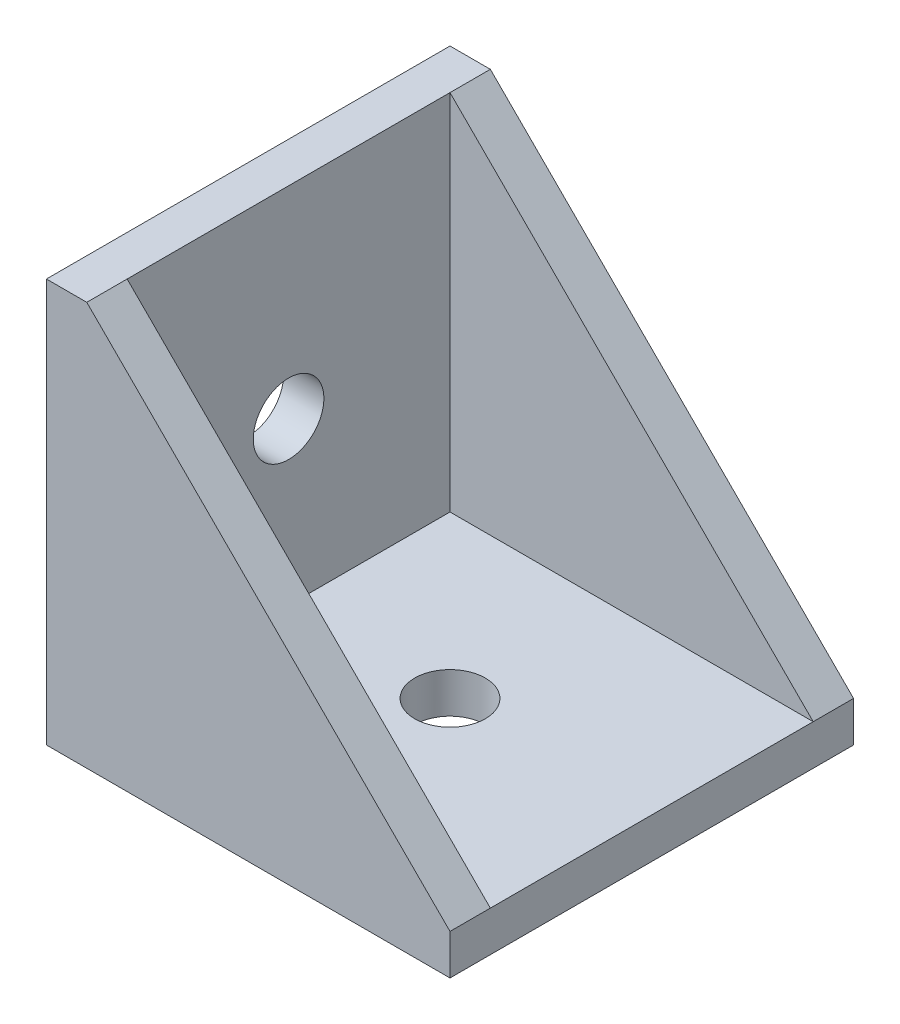
ISO-10303-21;
HEADER;
FILE_DESCRIPTION(('STEP AP214'),'2;1');
FILE_NAME('part.step','',(''),(''),'','','');
FILE_SCHEMA(('AUTOMOTIVE_DESIGN { 1 0 10303 214 1 1 1 1 }'));
ENDSEC;
DATA;
#1=APPLICATION_CONTEXT('core data for automotive mechanical design processes');
#2=APPLICATION_PROTOCOL_DEFINITION('international standard','automotive_design',2000,#1);
#3=PRODUCT_CONTEXT('',#1,'mechanical');
#4=PRODUCT('Part','Part','',(#3));
#5=PRODUCT_RELATED_PRODUCT_CATEGORY('part','',(#4));
#6=PRODUCT_DEFINITION_FORMATION('','',#4);
#7=PRODUCT_DEFINITION_CONTEXT('part definition',#1,'design');
#8=PRODUCT_DEFINITION('design','',#6,#7);
#9=PRODUCT_DEFINITION_SHAPE('','',#8);
#10=(LENGTH_UNIT() NAMED_UNIT(*) SI_UNIT(.MILLI.,.METRE.));
#11=(NAMED_UNIT(*) PLANE_ANGLE_UNIT() SI_UNIT($,.RADIAN.));
#12=(NAMED_UNIT(*) SI_UNIT($,.STERADIAN.) SOLID_ANGLE_UNIT());
#13=UNCERTAINTY_MEASURE_WITH_UNIT(LENGTH_MEASURE(1.E-05),#10,'distance_accuracy_value','');
#14=(GEOMETRIC_REPRESENTATION_CONTEXT(3) GLOBAL_UNCERTAINTY_ASSIGNED_CONTEXT((#13)) GLOBAL_UNIT_ASSIGNED_CONTEXT((#10,
#11,#12)) REPRESENTATION_CONTEXT('',''));
#15=CARTESIAN_POINT('',(0.,0.,0.));
#16=DIRECTION('',(0.,0.,1.));
#17=DIRECTION('',(1.,0.,0.));
#18=AXIS2_PLACEMENT_3D('',#15,#16,#17);
#19=CARTESIAN_POINT('',(2.,20.,20.));
#20=DIRECTION('',(-0.707106781186548,-0.707106781186548,0.));
#21=DIRECTION('',(0.707106781186548,-0.707106781186548,0.));
#22=AXIS2_PLACEMENT_3D('',#19,#20,#21);
#23=PLANE('',#22);
#24=DIRECTION('',(0.,0.,-1.));
#25=VECTOR('',#24,1.);
#26=CARTESIAN_POINT('',(2.,20.,20.));
#27=LINE('',#26,#25);
#28=CARTESIAN_POINT('',(2.,20.,2.));
#29=VERTEX_POINT('',#28);
#30=CARTESIAN_POINT('',(2.,20.,0.));
#31=VERTEX_POINT('',#30);
#32=EDGE_CURVE('E163',#29,#31,#27,.T.);
#33=ORIENTED_EDGE('',*,*,#32,.F.);
#34=DIRECTION('',(0.707106781186548,-0.707106781186548,0.));
#35=VECTOR('',#34,1.);
#36=CARTESIAN_POINT('',(2.,20.,2.));
#37=LINE('',#36,#35);
#38=CARTESIAN_POINT('',(20.,2.,2.));
#39=VERTEX_POINT('',#38);
#40=EDGE_CURVE('E11',#29,#39,#37,.T.);
#41=ORIENTED_EDGE('',*,*,#40,.T.);
#42=DIRECTION('',(0.,0.,-1.));
#43=VECTOR('',#42,1.);
#44=CARTESIAN_POINT('',(20.,2.,20.));
#45=LINE('',#44,#43);
#46=CARTESIAN_POINT('',(20.,2.,0.));
#47=VERTEX_POINT('',#46);
#48=EDGE_CURVE('E132',#39,#47,#45,.T.);
#49=ORIENTED_EDGE('',*,*,#48,.T.);
#50=DIRECTION('',(-0.707106781186547,0.707106781186547,0.));
#51=VECTOR('',#50,1.);
#52=CARTESIAN_POINT('',(2.,20.,0.));
#53=LINE('',#52,#51);
#54=EDGE_CURVE('E154',#47,#31,#53,.T.);
#55=ORIENTED_EDGE('',*,*,#54,.T.);
#56=EDGE_LOOP('',(#33,#41,#49,#55));
#57=FACE_BOUND('',#56,.T.);
#58=ADVANCED_FACE('F43',(#57),#23,.F.);
#59=CARTESIAN_POINT('',(0.,0.,20.));
#60=DIRECTION('',(1.,0.,0.));
#61=DIRECTION('',(0.,0.,-1.));
#62=AXIS2_PLACEMENT_3D('',#59,#60,#61);
#63=PLANE('',#62);
#64=CARTESIAN_POINT('',(0.,9.99999999999545,9.99999999999545));
#65=DIRECTION('',(-1.,0.,0.));
#66=DIRECTION('',(0.,0.,1.));
#67=AXIS2_PLACEMENT_3D('',#64,#65,#66);
#68=CIRCLE('',#67,1.75);
#69=CARTESIAN_POINT('',(0.,9.99999999999545,11.7499999999955));
#70=VERTEX_POINT('',#69);
#71=EDGE_CURVE('E189',#70,#70,#68,.T.);
#72=ORIENTED_EDGE('',*,*,#71,.F.);
#73=EDGE_LOOP('',(#72));
#74=FACE_BOUND('',#73,.T.);
#75=DIRECTION('',(0.,-1.,0.));
#76=VECTOR('',#75,1.);
#77=CARTESIAN_POINT('',(0.,0.,0.));
#78=LINE('',#77,#76);
#79=CARTESIAN_POINT('',(0.,20.,0.));
#80=VERTEX_POINT('',#79);
#81=CARTESIAN_POINT('',(0.,0.,0.));
#82=VERTEX_POINT('',#81);
#83=EDGE_CURVE('E144',#80,#82,#78,.T.);
#84=ORIENTED_EDGE('',*,*,#83,.T.);
#85=DIRECTION('',(0.,0.,-1.));
#86=VECTOR('',#85,1.);
#87=CARTESIAN_POINT('',(0.,0.,20.));
#88=LINE('',#87,#86);
#89=CARTESIAN_POINT('',(0.,0.,20.));
#90=VERTEX_POINT('',#89);
#91=EDGE_CURVE('E168',#90,#82,#88,.T.);
#92=ORIENTED_EDGE('',*,*,#91,.F.);
#93=DIRECTION('',(0.,-1.,0.));
#94=VECTOR('',#93,1.);
#95=CARTESIAN_POINT('',(0.,0.,20.));
#96=LINE('',#95,#94);
#97=CARTESIAN_POINT('',(0.,20.,20.));
#98=VERTEX_POINT('',#97);
#99=EDGE_CURVE('E160',#98,#90,#96,.T.);
#100=ORIENTED_EDGE('',*,*,#99,.F.);
#101=DIRECTION('',(0.,0.,-1.));
#102=VECTOR('',#101,1.);
#103=CARTESIAN_POINT('',(0.,20.,20.));
#104=LINE('',#103,#102);
#105=EDGE_CURVE('E140',#98,#80,#104,.T.);
#106=ORIENTED_EDGE('',*,*,#105,.T.);
#107=EDGE_LOOP('',(#84,#92,#100,#106));
#108=FACE_BOUND('',#107,.T.);
#109=ADVANCED_FACE('F45',(#74,#108),#63,.F.);
#110=CARTESIAN_POINT('',(0.,0.,20.));
#111=DIRECTION('',(0.,1.,0.));
#112=DIRECTION('',(0.,0.,1.));
#113=AXIS2_PLACEMENT_3D('',#110,#111,#112);
#114=PLANE('',#113);
#115=CARTESIAN_POINT('',(10.,0.,10.));
#116=DIRECTION('',(0.,-1.,0.));
#117=DIRECTION('',(0.,0.,-1.));
#118=AXIS2_PLACEMENT_3D('',#115,#116,#117);
#119=CIRCLE('',#118,1.75);
#120=CARTESIAN_POINT('',(10.,0.,8.25));
#121=VERTEX_POINT('',#120);
#122=EDGE_CURVE('E176',#121,#121,#119,.T.);
#123=ORIENTED_EDGE('',*,*,#122,.F.);
#124=EDGE_LOOP('',(#123));
#125=FACE_BOUND('',#124,.T.);
#126=DIRECTION('',(1.,0.,0.));
#127=VECTOR('',#126,1.);
#128=CARTESIAN_POINT('',(0.,0.,0.));
#129=LINE('',#128,#127);
#130=CARTESIAN_POINT('',(20.,0.,0.));
#131=VERTEX_POINT('',#130);
#132=EDGE_CURVE('E148',#82,#131,#129,.T.);
#133=ORIENTED_EDGE('',*,*,#132,.T.);
#134=DIRECTION('',(0.,0.,-1.));
#135=VECTOR('',#134,1.);
#136=CARTESIAN_POINT('',(20.,0.,20.));
#137=LINE('',#136,#135);
#138=CARTESIAN_POINT('',(20.,0.,20.));
#139=VERTEX_POINT('',#138);
#140=EDGE_CURVE('E131',#139,#131,#137,.T.);
#141=ORIENTED_EDGE('',*,*,#140,.F.);
#142=DIRECTION('',(1.,0.,0.));
#143=VECTOR('',#142,1.);
#144=CARTESIAN_POINT('',(0.,0.,20.));
#145=LINE('',#144,#143);
#146=EDGE_CURVE('E102',#90,#139,#145,.T.);
#147=ORIENTED_EDGE('',*,*,#146,.F.);
#148=ORIENTED_EDGE('',*,*,#91,.T.);
#149=EDGE_LOOP('',(#133,#141,#147,#148));
#150=FACE_BOUND('',#149,.T.);
#151=ADVANCED_FACE('F217',(#125,#150),#114,.F.);
#152=CARTESIAN_POINT('',(20.,0.,20.));
#153=DIRECTION('',(-1.,0.,0.));
#154=DIRECTION('',(0.,0.,1.));
#155=AXIS2_PLACEMENT_3D('',#152,#153,#154);
#156=PLANE('',#155);
#157=DIRECTION('',(0.,1.,0.));
#158=VECTOR('',#157,1.);
#159=CARTESIAN_POINT('',(20.,0.,0.));
#160=LINE('',#159,#158);
#161=EDGE_CURVE('E151',#131,#47,#160,.T.);
#162=ORIENTED_EDGE('',*,*,#161,.T.);
#163=ORIENTED_EDGE('',*,*,#48,.F.);
#164=DIRECTION('',(0.,0.,-1.));
#165=VECTOR('',#164,1.);
#166=CARTESIAN_POINT('',(20.,2.,2.));
#167=LINE('',#166,#165);
#168=CARTESIAN_POINT('',(20.,2.,18.));
#169=VERTEX_POINT('',#168);
#170=EDGE_CURVE('E127',#169,#39,#167,.T.);
#171=ORIENTED_EDGE('',*,*,#170,.F.);
#172=CARTESIAN_POINT('',(20.,2.,20.));
#173=VERTEX_POINT('',#172);
#174=EDGE_CURVE('E121',#173,#169,#45,.T.);
#175=ORIENTED_EDGE('',*,*,#174,.F.);
#176=DIRECTION('',(0.,1.,0.));
#177=VECTOR('',#176,1.);
#178=CARTESIAN_POINT('',(20.,0.,20.));
#179=LINE('',#178,#177);
#180=EDGE_CURVE('E109',#139,#173,#179,.T.);
#181=ORIENTED_EDGE('',*,*,#180,.F.);
#182=ORIENTED_EDGE('',*,*,#140,.T.);
#183=EDGE_LOOP('',(#162,#163,#171,#175,#181,#182));
#184=FACE_BOUND('',#183,.T.);
#185=ADVANCED_FACE('F123',(#184),#156,.F.);
#186=ORIENTED_EDGE('',*,*,#174,.T.);
#187=DIRECTION('',(-0.707106781186548,0.707106781186548,0.));
#188=VECTOR('',#187,1.);
#189=CARTESIAN_POINT('',(2.,20.,18.));
#190=LINE('',#189,#188);
#191=CARTESIAN_POINT('',(2.,20.,18.));
#192=VERTEX_POINT('',#191);
#193=EDGE_CURVE('E53',#169,#192,#190,.T.);
#194=ORIENTED_EDGE('',*,*,#193,.T.);
#195=CARTESIAN_POINT('',(2.,20.,20.));
#196=VERTEX_POINT('',#195);
#197=EDGE_CURVE('E136',#196,#192,#27,.T.);
#198=ORIENTED_EDGE('',*,*,#197,.F.);
#199=DIRECTION('',(-0.707106781186547,0.707106781186547,0.));
#200=VECTOR('',#199,1.);
#201=CARTESIAN_POINT('',(2.,20.,20.));
#202=LINE('',#201,#200);
#203=EDGE_CURVE('E113',#173,#196,#202,.T.);
#204=ORIENTED_EDGE('',*,*,#203,.F.);
#205=EDGE_LOOP('',(#186,#194,#198,#204));
#206=FACE_BOUND('',#205,.T.);
#207=ADVANCED_FACE('F134',(#206),#23,.F.);
#208=CARTESIAN_POINT('',(0.,20.,20.));
#209=DIRECTION('',(0.,-1.,0.));
#210=DIRECTION('',(0.,0.,-1.));
#211=AXIS2_PLACEMENT_3D('',#208,#209,#210);
#212=PLANE('',#211);
#213=DIRECTION('',(-1.,0.,0.));
#214=VECTOR('',#213,1.);
#215=CARTESIAN_POINT('',(0.,20.,0.));
#216=LINE('',#215,#214);
#217=EDGE_CURVE('E93',#31,#80,#216,.T.);
#218=ORIENTED_EDGE('',*,*,#217,.T.);
#219=ORIENTED_EDGE('',*,*,#105,.F.);
#220=DIRECTION('',(-1.,0.,0.));
#221=VECTOR('',#220,1.);
#222=CARTESIAN_POINT('',(0.,20.,20.));
#223=LINE('',#222,#221);
#224=EDGE_CURVE('E70',#196,#98,#223,.T.);
#225=ORIENTED_EDGE('',*,*,#224,.F.);
#226=ORIENTED_EDGE('',*,*,#197,.T.);
#227=DIRECTION('',(0.,0.,1.));
#228=VECTOR('',#227,1.);
#229=CARTESIAN_POINT('',(2.,20.,2.));
#230=LINE('',#229,#228);
#231=EDGE_CURVE('E175',#29,#192,#230,.T.);
#232=ORIENTED_EDGE('',*,*,#231,.F.);
#233=ORIENTED_EDGE('',*,*,#32,.T.);
#234=EDGE_LOOP('',(#218,#219,#225,#226,#232,#233));
#235=FACE_BOUND('',#234,.T.);
#236=ADVANCED_FACE('F228',(#235),#212,.F.);
#237=CARTESIAN_POINT('',(0.,0.,20.));
#238=DIRECTION('',(0.,0.,-1.));
#239=DIRECTION('',(-1.,0.,0.));
#240=AXIS2_PLACEMENT_3D('',#237,#238,#239);
#241=PLANE('',#240);
#242=ORIENTED_EDGE('',*,*,#99,.T.);
#243=ORIENTED_EDGE('',*,*,#146,.T.);
#244=ORIENTED_EDGE('',*,*,#180,.T.);
#245=ORIENTED_EDGE('',*,*,#203,.T.);
#246=ORIENTED_EDGE('',*,*,#224,.T.);
#247=EDGE_LOOP('',(#242,#243,#244,#245,#246));
#248=FACE_BOUND('',#247,.T.);
#249=ADVANCED_FACE('F111',(#248),#241,.F.);
#250=CARTESIAN_POINT('',(0.,0.,0.));
#251=DIRECTION('',(0.,0.,-1.));
#252=DIRECTION('',(-1.,0.,0.));
#253=AXIS2_PLACEMENT_3D('',#250,#251,#252);
#254=PLANE('',#253);
#255=ORIENTED_EDGE('',*,*,#83,.F.);
#256=ORIENTED_EDGE('',*,*,#217,.F.);
#257=ORIENTED_EDGE('',*,*,#54,.F.);
#258=ORIENTED_EDGE('',*,*,#161,.F.);
#259=ORIENTED_EDGE('',*,*,#132,.F.);
#260=EDGE_LOOP('',(#255,#256,#257,#258,#259));
#261=FACE_BOUND('',#260,.T.);
#262=ADVANCED_FACE('F221',(#261),#254,.T.);
#263=CARTESIAN_POINT('',(2.,2.,2.));
#264=DIRECTION('',(0.,0.,-1.));
#265=DIRECTION('',(-1.,0.,0.));
#266=AXIS2_PLACEMENT_3D('',#263,#264,#265);
#267=PLANE('',#266);
#268=DIRECTION('',(0.,1.,0.));
#269=VECTOR('',#268,1.);
#270=CARTESIAN_POINT('',(2.,2.,2.));
#271=LINE('',#270,#269);
#272=CARTESIAN_POINT('',(2.,2.,2.));
#273=VERTEX_POINT('',#272);
#274=EDGE_CURVE('E61',#273,#29,#271,.T.);
#275=ORIENTED_EDGE('',*,*,#274,.F.);
#276=DIRECTION('',(-1.,0.,0.));
#277=VECTOR('',#276,1.);
#278=CARTESIAN_POINT('',(2.,2.,2.));
#279=LINE('',#278,#277);
#280=EDGE_CURVE('E201',#39,#273,#279,.T.);
#281=ORIENTED_EDGE('',*,*,#280,.F.);
#282=ORIENTED_EDGE('',*,*,#40,.F.);
#283=EDGE_LOOP('',(#275,#281,#282));
#284=FACE_BOUND('',#283,.T.);
#285=ADVANCED_FACE('F243',(#284),#267,.F.);
#286=CARTESIAN_POINT('',(2.,2.,18.));
#287=DIRECTION('',(0.,0.,1.));
#288=DIRECTION('',(1.,0.,0.));
#289=AXIS2_PLACEMENT_3D('',#286,#287,#288);
#290=PLANE('',#289);
#291=DIRECTION('',(1.,0.,0.));
#292=VECTOR('',#291,1.);
#293=CARTESIAN_POINT('',(2.,2.,18.));
#294=LINE('',#293,#292);
#295=CARTESIAN_POINT('',(2.,2.,18.));
#296=VERTEX_POINT('',#295);
#297=EDGE_CURVE('E195',#296,#169,#294,.T.);
#298=ORIENTED_EDGE('',*,*,#297,.F.);
#299=DIRECTION('',(0.,1.,0.));
#300=VECTOR('',#299,1.);
#301=CARTESIAN_POINT('',(2.,2.,18.));
#302=LINE('',#301,#300);
#303=EDGE_CURVE('E204',#296,#192,#302,.T.);
#304=ORIENTED_EDGE('',*,*,#303,.T.);
#305=ORIENTED_EDGE('',*,*,#193,.F.);
#306=EDGE_LOOP('',(#298,#304,#305));
#307=FACE_BOUND('',#306,.T.);
#308=ADVANCED_FACE('F235',(#307),#290,.F.);
#309=CARTESIAN_POINT('',(2.,2.,2.));
#310=DIRECTION('',(-1.,0.,0.));
#311=DIRECTION('',(0.,0.,1.));
#312=AXIS2_PLACEMENT_3D('',#309,#310,#311);
#313=PLANE('',#312);
#314=CARTESIAN_POINT('',(2.,9.99999999999545,9.99999999999545));
#315=DIRECTION('',(-1.,0.,0.));
#316=DIRECTION('',(0.,0.,1.));
#317=AXIS2_PLACEMENT_3D('',#314,#315,#316);
#318=CIRCLE('',#317,1.75);
#319=CARTESIAN_POINT('',(2.,9.99999999999545,11.7499999999955));
#320=VERTEX_POINT('',#319);
#321=EDGE_CURVE('E47',#320,#320,#318,.T.);
#322=ORIENTED_EDGE('',*,*,#321,.T.);
#323=EDGE_LOOP('',(#322));
#324=FACE_BOUND('',#323,.T.);
#325=ORIENTED_EDGE('',*,*,#231,.T.);
#326=ORIENTED_EDGE('',*,*,#303,.F.);
#327=DIRECTION('',(0.,0.,1.));
#328=VECTOR('',#327,1.);
#329=CARTESIAN_POINT('',(2.,2.,2.));
#330=LINE('',#329,#328);
#331=EDGE_CURVE('E181',#273,#296,#330,.T.);
#332=ORIENTED_EDGE('',*,*,#331,.F.);
#333=ORIENTED_EDGE('',*,*,#274,.T.);
#334=EDGE_LOOP('',(#325,#326,#332,#333));
#335=FACE_BOUND('',#334,.T.);
#336=ADVANCED_FACE('F230',(#324,#335),#313,.F.);
#337=CARTESIAN_POINT('',(0.,2.,0.));
#338=DIRECTION('',(0.,1.,0.));
#339=DIRECTION('',(0.,0.,1.));
#340=AXIS2_PLACEMENT_3D('',#337,#338,#339);
#341=PLANE('',#340);
#342=CARTESIAN_POINT('',(10.,2.,10.));
#343=DIRECTION('',(0.,1.,0.));
#344=DIRECTION('',(0.,0.,1.));
#345=AXIS2_PLACEMENT_3D('',#342,#343,#344);
#346=CIRCLE('',#345,1.75);
#347=CARTESIAN_POINT('',(10.,2.,11.75));
#348=VERTEX_POINT('',#347);
#349=EDGE_CURVE('E172',#348,#348,#346,.T.);
#350=ORIENTED_EDGE('',*,*,#349,.F.);
#351=EDGE_LOOP('',(#350));
#352=FACE_BOUND('',#351,.T.);
#353=ORIENTED_EDGE('',*,*,#331,.T.);
#354=ORIENTED_EDGE('',*,*,#297,.T.);
#355=ORIENTED_EDGE('',*,*,#170,.T.);
#356=ORIENTED_EDGE('',*,*,#280,.T.);
#357=EDGE_LOOP('',(#353,#354,#355,#356));
#358=FACE_BOUND('',#357,.T.);
#359=ADVANCED_FACE('F238',(#352,#358),#341,.T.);
#360=CARTESIAN_POINT('',(10.,18.,10.));
#361=DIRECTION('',(0.,-1.,0.));
#362=DIRECTION('',(0.,0.,-1.));
#363=AXIS2_PLACEMENT_3D('',#360,#361,#362);
#364=CYLINDRICAL_SURFACE('',#363,1.75);
#365=ORIENTED_EDGE('',*,*,#349,.T.);
#366=EDGE_LOOP('',(#365));
#367=FACE_BOUND('',#366,.T.);
#368=ORIENTED_EDGE('',*,*,#122,.T.);
#369=EDGE_LOOP('',(#368));
#370=FACE_BOUND('',#369,.T.);
#371=ADVANCED_FACE('F285',(#367,#370),#364,.F.);
#372=CARTESIAN_POINT('',(18.,9.99999999999545,9.99999999999545));
#373=DIRECTION('',(-1.,0.,0.));
#374=DIRECTION('',(0.,0.,1.));
#375=AXIS2_PLACEMENT_3D('',#372,#373,#374);
#376=CYLINDRICAL_SURFACE('',#375,1.75);
#377=ORIENTED_EDGE('',*,*,#71,.T.);
#378=EDGE_LOOP('',(#377));
#379=FACE_BOUND('',#378,.T.);
#380=ORIENTED_EDGE('',*,*,#321,.F.);
#381=EDGE_LOOP('',(#380));
#382=FACE_BOUND('',#381,.T.);
#383=ADVANCED_FACE('F302',(#379,#382),#376,.F.);
#384=CLOSED_SHELL('',(#58,#109,#151,#185,#207,#236,#249,#262,#285,#308,#336,#359,#371,#383));
#385=MANIFOLD_SOLID_BREP('B2',#384);
#386=ADVANCED_BREP_SHAPE_REPRESENTATION('',(#18,#385),#14);
#387=SHAPE_DEFINITION_REPRESENTATION(#9,#386);
ENDSEC;
END-ISO-10303-21;
